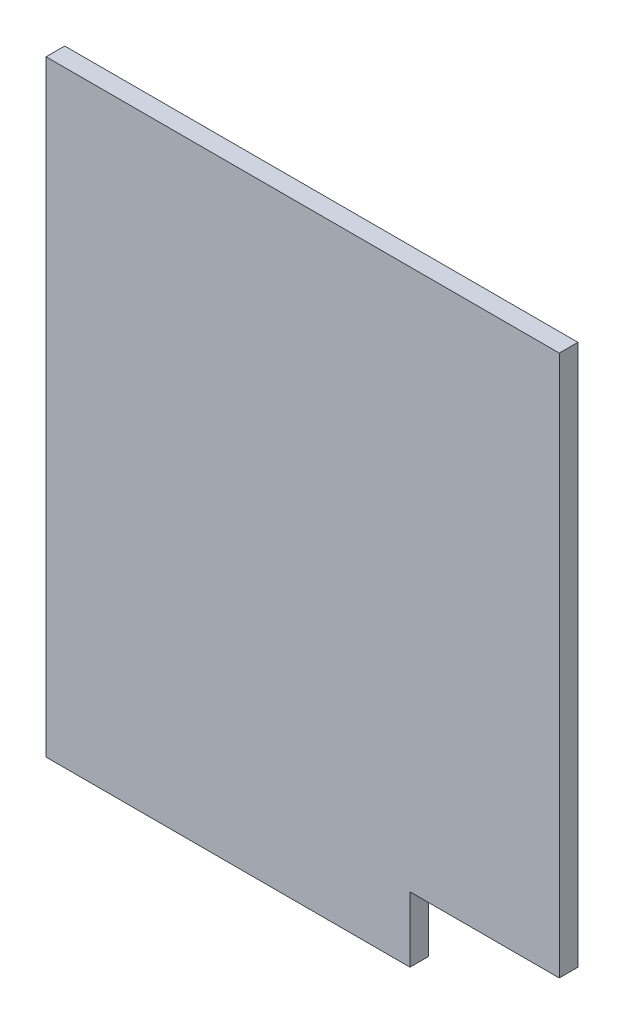
ISO-10303-21;
HEADER;
FILE_DESCRIPTION(('STEP AP214'),'2;1');
FILE_NAME('part.step','',(''),(''),'','','');
FILE_SCHEMA(('AUTOMOTIVE_DESIGN { 1 0 10303 214 1 1 1 1 }'));
ENDSEC;
DATA;
#1=APPLICATION_CONTEXT('core data for automotive mechanical design processes');
#2=APPLICATION_PROTOCOL_DEFINITION('international standard','automotive_design',2000,#1);
#3=PRODUCT_CONTEXT('',#1,'mechanical');
#4=PRODUCT('Part','Part','',(#3));
#5=PRODUCT_RELATED_PRODUCT_CATEGORY('part','',(#4));
#6=PRODUCT_DEFINITION_FORMATION('','',#4);
#7=PRODUCT_DEFINITION_CONTEXT('part definition',#1,'design');
#8=PRODUCT_DEFINITION('design','',#6,#7);
#9=PRODUCT_DEFINITION_SHAPE('','',#8);
#10=(LENGTH_UNIT() NAMED_UNIT(*) SI_UNIT(.MILLI.,.METRE.));
#11=(NAMED_UNIT(*) PLANE_ANGLE_UNIT() SI_UNIT($,.RADIAN.));
#12=(NAMED_UNIT(*) SI_UNIT($,.STERADIAN.) SOLID_ANGLE_UNIT());
#13=UNCERTAINTY_MEASURE_WITH_UNIT(LENGTH_MEASURE(1.E-05),#10,'distance_accuracy_value','');
#14=(GEOMETRIC_REPRESENTATION_CONTEXT(3) GLOBAL_UNCERTAINTY_ASSIGNED_CONTEXT((#13)) GLOBAL_UNIT_ASSIGNED_CONTEXT((#10,
#11,#12)) REPRESENTATION_CONTEXT('',''));
#15=CARTESIAN_POINT('',(0.,0.,0.));
#16=DIRECTION('',(0.,0.,1.));
#17=DIRECTION('',(1.,0.,0.));
#18=AXIS2_PLACEMENT_3D('',#15,#16,#17);
#19=CARTESIAN_POINT('',(27.5,-32.5,2.));
#20=DIRECTION('',(-1.,0.,0.));
#21=DIRECTION('',(0.,0.,1.));
#22=AXIS2_PLACEMENT_3D('',#19,#20,#21);
#23=PLANE('',#22);
#24=DIRECTION('',(0.,1.,0.));
#25=VECTOR('',#24,1.);
#26=CARTESIAN_POINT('',(27.5,-32.5,2.));
#27=LINE('',#26,#25);
#28=CARTESIAN_POINT('',(27.5,-25.5,2.));
#29=VERTEX_POINT('',#28);
#30=CARTESIAN_POINT('',(27.5,32.5,2.));
#31=VERTEX_POINT('',#30);
#32=EDGE_CURVE('E80',#29,#31,#27,.T.);
#33=ORIENTED_EDGE('',*,*,#32,.F.);
#34=DIRECTION('',(0.,0.,1.));
#35=VECTOR('',#34,1.);
#36=CARTESIAN_POINT('',(27.5,-25.5,0.));
#37=LINE('',#36,#35);
#38=CARTESIAN_POINT('',(27.5,-25.5,0.));
#39=VERTEX_POINT('',#38);
#40=EDGE_CURVE('E100',#39,#29,#37,.T.);
#41=ORIENTED_EDGE('',*,*,#40,.F.);
#42=DIRECTION('',(0.,1.,0.));
#43=VECTOR('',#42,1.);
#44=CARTESIAN_POINT('',(27.5,-32.5,0.));
#45=LINE('',#44,#43);
#46=CARTESIAN_POINT('',(27.5,32.5,0.));
#47=VERTEX_POINT('',#46);
#48=EDGE_CURVE('E108',#39,#47,#45,.T.);
#49=ORIENTED_EDGE('',*,*,#48,.T.);
#50=DIRECTION('',(0.,0.,-1.));
#51=VECTOR('',#50,1.);
#52=CARTESIAN_POINT('',(27.5,32.5,2.));
#53=LINE('',#52,#51);
#54=EDGE_CURVE('E11',#31,#47,#53,.T.);
#55=ORIENTED_EDGE('',*,*,#54,.F.);
#56=EDGE_LOOP('',(#33,#41,#49,#55));
#57=FACE_BOUND('',#56,.T.);
#58=ADVANCED_FACE('F35',(#57),#23,.F.);
#59=CARTESIAN_POINT('',(-27.5,32.5,2.));
#60=DIRECTION('',(0.,-1.,0.));
#61=DIRECTION('',(0.,0.,-1.));
#62=AXIS2_PLACEMENT_3D('',#59,#60,#61);
#63=PLANE('',#62);
#64=DIRECTION('',(-1.,0.,0.));
#65=VECTOR('',#64,1.);
#66=CARTESIAN_POINT('',(-27.5,32.5,0.));
#67=LINE('',#66,#65);
#68=CARTESIAN_POINT('',(-27.5,32.5,0.));
#69=VERTEX_POINT('',#68);
#70=EDGE_CURVE('E112',#47,#69,#67,.T.);
#71=ORIENTED_EDGE('',*,*,#70,.T.);
#72=DIRECTION('',(0.,0.,-1.));
#73=VECTOR('',#72,1.);
#74=CARTESIAN_POINT('',(-27.5,32.5,2.));
#75=LINE('',#74,#73);
#76=CARTESIAN_POINT('',(-27.5,32.5,2.));
#77=VERTEX_POINT('',#76);
#78=EDGE_CURVE('E42',#77,#69,#75,.T.);
#79=ORIENTED_EDGE('',*,*,#78,.F.);
#80=DIRECTION('',(-1.,0.,0.));
#81=VECTOR('',#80,1.);
#82=CARTESIAN_POINT('',(-27.5,32.5,2.));
#83=LINE('',#82,#81);
#84=EDGE_CURVE('E135',#31,#77,#83,.T.);
#85=ORIENTED_EDGE('',*,*,#84,.F.);
#86=ORIENTED_EDGE('',*,*,#54,.T.);
#87=EDGE_LOOP('',(#71,#79,#85,#86));
#88=FACE_BOUND('',#87,.T.);
#89=ADVANCED_FACE('F154',(#88),#63,.F.);
#90=CARTESIAN_POINT('',(-27.5,-32.5,2.));
#91=DIRECTION('',(1.,0.,0.));
#92=DIRECTION('',(0.,0.,-1.));
#93=AXIS2_PLACEMENT_3D('',#90,#91,#92);
#94=PLANE('',#93);
#95=DIRECTION('',(0.,-1.,0.));
#96=VECTOR('',#95,1.);
#97=CARTESIAN_POINT('',(-27.5,-32.5,0.));
#98=LINE('',#97,#96);
#99=CARTESIAN_POINT('',(-27.5,-32.5,0.));
#100=VERTEX_POINT('',#99);
#101=EDGE_CURVE('E75',#69,#100,#98,.T.);
#102=ORIENTED_EDGE('',*,*,#101,.T.);
#103=DIRECTION('',(0.,0.,-1.));
#104=VECTOR('',#103,1.);
#105=CARTESIAN_POINT('',(-27.5,-32.5,2.));
#106=LINE('',#105,#104);
#107=CARTESIAN_POINT('',(-27.5,-32.5,2.));
#108=VERTEX_POINT('',#107);
#109=EDGE_CURVE('E126',#108,#100,#106,.T.);
#110=ORIENTED_EDGE('',*,*,#109,.F.);
#111=DIRECTION('',(0.,-1.,0.));
#112=VECTOR('',#111,1.);
#113=CARTESIAN_POINT('',(-27.5,-32.5,2.));
#114=LINE('',#113,#112);
#115=EDGE_CURVE('E58',#77,#108,#114,.T.);
#116=ORIENTED_EDGE('',*,*,#115,.F.);
#117=ORIENTED_EDGE('',*,*,#78,.T.);
#118=EDGE_LOOP('',(#102,#110,#116,#117));
#119=FACE_BOUND('',#118,.T.);
#120=ADVANCED_FACE('F128',(#119),#94,.F.);
#121=CARTESIAN_POINT('',(-27.5,-32.5,2.));
#122=DIRECTION('',(0.,1.,0.));
#123=DIRECTION('',(0.,0.,1.));
#124=AXIS2_PLACEMENT_3D('',#121,#122,#123);
#125=PLANE('',#124);
#126=DIRECTION('',(1.,0.,0.));
#127=VECTOR('',#126,1.);
#128=CARTESIAN_POINT('',(-27.5,-32.5,0.));
#129=LINE('',#128,#127);
#130=CARTESIAN_POINT('',(11.5,-32.5,0.));
#131=VERTEX_POINT('',#130);
#132=EDGE_CURVE('E123',#100,#131,#129,.T.);
#133=ORIENTED_EDGE('',*,*,#132,.T.);
#134=DIRECTION('',(0.,0.,1.));
#135=VECTOR('',#134,1.);
#136=CARTESIAN_POINT('',(11.5,-32.5,0.));
#137=LINE('',#136,#135);
#138=CARTESIAN_POINT('',(11.5,-32.5,2.));
#139=VERTEX_POINT('',#138);
#140=EDGE_CURVE('E113',#131,#139,#137,.T.);
#141=ORIENTED_EDGE('',*,*,#140,.T.);
#142=DIRECTION('',(1.,0.,0.));
#143=VECTOR('',#142,1.);
#144=CARTESIAN_POINT('',(-27.5,-32.5,2.));
#145=LINE('',#144,#143);
#146=EDGE_CURVE('E119',#108,#139,#145,.T.);
#147=ORIENTED_EDGE('',*,*,#146,.F.);
#148=ORIENTED_EDGE('',*,*,#109,.T.);
#149=EDGE_LOOP('',(#133,#141,#147,#148));
#150=FACE_BOUND('',#149,.T.);
#151=ADVANCED_FACE('F132',(#150),#125,.F.);
#152=CARTESIAN_POINT('',(0.,0.,2.));
#153=DIRECTION('',(0.,0.,-1.));
#154=DIRECTION('',(-1.,0.,0.));
#155=AXIS2_PLACEMENT_3D('',#152,#153,#154);
#156=PLANE('',#155);
#157=ORIENTED_EDGE('',*,*,#146,.T.);
#158=DIRECTION('',(0.,-1.,0.));
#159=VECTOR('',#158,1.);
#160=CARTESIAN_POINT('',(11.5,-32.5,2.));
#161=LINE('',#160,#159);
#162=CARTESIAN_POINT('',(11.5,-25.5,2.));
#163=VERTEX_POINT('',#162);
#164=EDGE_CURVE('E104',#163,#139,#161,.T.);
#165=ORIENTED_EDGE('',*,*,#164,.F.);
#166=DIRECTION('',(-1.,0.,0.));
#167=VECTOR('',#166,1.);
#168=CARTESIAN_POINT('',(27.5,-25.5,2.));
#169=LINE('',#168,#167);
#170=EDGE_CURVE('E141',#29,#163,#169,.T.);
#171=ORIENTED_EDGE('',*,*,#170,.F.);
#172=ORIENTED_EDGE('',*,*,#32,.T.);
#173=ORIENTED_EDGE('',*,*,#84,.T.);
#174=ORIENTED_EDGE('',*,*,#115,.T.);
#175=EDGE_LOOP('',(#157,#165,#171,#172,#173,#174));
#176=FACE_BOUND('',#175,.T.);
#177=ADVANCED_FACE('F143',(#176),#156,.F.);
#178=CARTESIAN_POINT('',(0.,0.,0.));
#179=DIRECTION('',(0.,0.,-1.));
#180=DIRECTION('',(-1.,0.,0.));
#181=AXIS2_PLACEMENT_3D('',#178,#179,#180);
#182=PLANE('',#181);
#183=DIRECTION('',(0.,-1.,0.));
#184=VECTOR('',#183,1.);
#185=CARTESIAN_POINT('',(11.5,-32.5,0.));
#186=LINE('',#185,#184);
#187=CARTESIAN_POINT('',(11.5,-25.5,0.));
#188=VERTEX_POINT('',#187);
#189=EDGE_CURVE('E49',#188,#131,#186,.T.);
#190=ORIENTED_EDGE('',*,*,#189,.T.);
#191=ORIENTED_EDGE('',*,*,#132,.F.);
#192=ORIENTED_EDGE('',*,*,#101,.F.);
#193=ORIENTED_EDGE('',*,*,#70,.F.);
#194=ORIENTED_EDGE('',*,*,#48,.F.);
#195=DIRECTION('',(-1.,0.,0.));
#196=VECTOR('',#195,1.);
#197=CARTESIAN_POINT('',(27.5,-25.5,0.));
#198=LINE('',#197,#196);
#199=EDGE_CURVE('E96',#39,#188,#198,.T.);
#200=ORIENTED_EDGE('',*,*,#199,.T.);
#201=EDGE_LOOP('',(#190,#191,#192,#193,#194,#200));
#202=FACE_BOUND('',#201,.T.);
#203=ADVANCED_FACE('F111',(#202),#182,.T.);
#204=CARTESIAN_POINT('',(11.5,-32.5,0.));
#205=DIRECTION('',(-1.,0.,0.));
#206=DIRECTION('',(0.,0.,1.));
#207=AXIS2_PLACEMENT_3D('',#204,#205,#206);
#208=PLANE('',#207);
#209=ORIENTED_EDGE('',*,*,#164,.T.);
#210=ORIENTED_EDGE('',*,*,#140,.F.);
#211=ORIENTED_EDGE('',*,*,#189,.F.);
#212=DIRECTION('',(0.,0.,1.));
#213=VECTOR('',#212,1.);
#214=CARTESIAN_POINT('',(11.5,-25.5,0.));
#215=LINE('',#214,#213);
#216=EDGE_CURVE('E101',#188,#163,#215,.T.);
#217=ORIENTED_EDGE('',*,*,#216,.T.);
#218=EDGE_LOOP('',(#209,#210,#211,#217));
#219=FACE_BOUND('',#218,.T.);
#220=ADVANCED_FACE('F144',(#219),#208,.F.);
#221=CARTESIAN_POINT('',(27.5,-25.5,0.));
#222=DIRECTION('',(0.,1.,0.));
#223=DIRECTION('',(-1.,0.,0.));
#224=AXIS2_PLACEMENT_3D('',#221,#222,#223);
#225=PLANE('',#224);
#226=ORIENTED_EDGE('',*,*,#170,.T.);
#227=ORIENTED_EDGE('',*,*,#216,.F.);
#228=ORIENTED_EDGE('',*,*,#199,.F.);
#229=ORIENTED_EDGE('',*,*,#40,.T.);
#230=EDGE_LOOP('',(#226,#227,#228,#229));
#231=FACE_BOUND('',#230,.T.);
#232=ADVANCED_FACE('F99',(#231),#225,.F.);
#233=CLOSED_SHELL('',(#58,#89,#120,#151,#177,#203,#220,#232));
#234=MANIFOLD_SOLID_BREP('B2',#233);
#235=ADVANCED_BREP_SHAPE_REPRESENTATION('',(#18,#234),#14);
#236=SHAPE_DEFINITION_REPRESENTATION(#9,#235);
ENDSEC;
END-ISO-10303-21;
